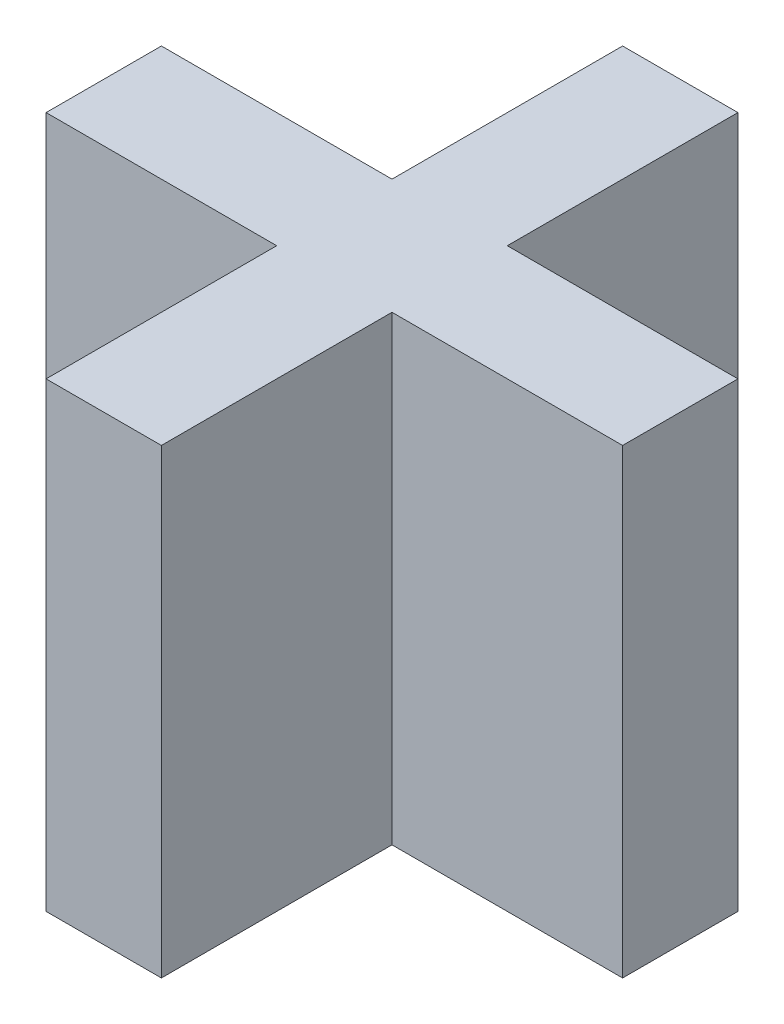
ISO-10303-21;
HEADER;
FILE_DESCRIPTION(('STEP AP214'),'2;1');
FILE_NAME('part.step','',(''),(''),'','','');
FILE_SCHEMA(('AUTOMOTIVE_DESIGN { 1 0 10303 214 1 1 1 1 }'));
ENDSEC;
DATA;
#1=APPLICATION_CONTEXT('core data for automotive mechanical design processes');
#2=APPLICATION_PROTOCOL_DEFINITION('international standard','automotive_design',2000,#1);
#3=PRODUCT_CONTEXT('',#1,'mechanical');
#4=PRODUCT('Part','Part','',(#3));
#5=PRODUCT_RELATED_PRODUCT_CATEGORY('part','',(#4));
#6=PRODUCT_DEFINITION_FORMATION('','',#4);
#7=PRODUCT_DEFINITION_CONTEXT('part definition',#1,'design');
#8=PRODUCT_DEFINITION('design','',#6,#7);
#9=PRODUCT_DEFINITION_SHAPE('','',#8);
#10=(LENGTH_UNIT() NAMED_UNIT(*) SI_UNIT(.MILLI.,.METRE.));
#11=(NAMED_UNIT(*) PLANE_ANGLE_UNIT() SI_UNIT($,.RADIAN.));
#12=(NAMED_UNIT(*) SI_UNIT($,.STERADIAN.) SOLID_ANGLE_UNIT());
#13=UNCERTAINTY_MEASURE_WITH_UNIT(LENGTH_MEASURE(1.E-05),#10,'distance_accuracy_value','');
#14=(GEOMETRIC_REPRESENTATION_CONTEXT(3) GLOBAL_UNCERTAINTY_ASSIGNED_CONTEXT((#13)) GLOBAL_UNIT_ASSIGNED_CONTEXT((#10,
#11,#12)) REPRESENTATION_CONTEXT('',''));
#15=CARTESIAN_POINT('',(0.,0.,0.));
#16=DIRECTION('',(0.,0.,1.));
#17=DIRECTION('',(1.,0.,0.));
#18=AXIS2_PLACEMENT_3D('',#15,#16,#17);
#19=CARTESIAN_POINT('',(-62.5,100.,-12.5));
#20=DIRECTION('',(1.,0.,0.));
#21=DIRECTION('',(0.,0.,-1.));
#22=AXIS2_PLACEMENT_3D('',#19,#20,#21);
#23=PLANE('',#22);
#24=DIRECTION('',(0.,0.,1.));
#25=VECTOR('',#24,1.);
#26=CARTESIAN_POINT('',(-62.5,0.,-12.5));
#27=LINE('',#26,#25);
#28=CARTESIAN_POINT('',(-62.5,0.,-12.5));
#29=VERTEX_POINT('',#28);
#30=CARTESIAN_POINT('',(-62.5,0.,12.5));
#31=VERTEX_POINT('',#30);
#32=EDGE_CURVE('E159',#29,#31,#27,.T.);
#33=ORIENTED_EDGE('',*,*,#32,.T.);
#34=DIRECTION('',(0.,-1.,0.));
#35=VECTOR('',#34,1.);
#36=CARTESIAN_POINT('',(-62.5,100.,12.5));
#37=LINE('',#36,#35);
#38=CARTESIAN_POINT('',(-62.5,100.,12.5));
#39=VERTEX_POINT('',#38);
#40=EDGE_CURVE('E11',#39,#31,#37,.T.);
#41=ORIENTED_EDGE('',*,*,#40,.F.);
#42=DIRECTION('',(0.,0.,1.));
#43=VECTOR('',#42,1.);
#44=CARTESIAN_POINT('',(-62.5,100.,-12.5));
#45=LINE('',#44,#43);
#46=CARTESIAN_POINT('',(-62.5,100.,-12.5));
#47=VERTEX_POINT('',#46);
#48=EDGE_CURVE('E182',#47,#39,#45,.T.);
#49=ORIENTED_EDGE('',*,*,#48,.F.);
#50=DIRECTION('',(0.,-1.,0.));
#51=VECTOR('',#50,1.);
#52=CARTESIAN_POINT('',(-62.5,100.,-12.5));
#53=LINE('',#52,#51);
#54=EDGE_CURVE('E155',#47,#29,#53,.T.);
#55=ORIENTED_EDGE('',*,*,#54,.T.);
#56=EDGE_LOOP('',(#33,#41,#49,#55));
#57=FACE_BOUND('',#56,.T.);
#58=ADVANCED_FACE('F39',(#57),#23,.F.);
#59=CARTESIAN_POINT('',(-62.5,100.,12.5));
#60=DIRECTION('',(0.,0.,-1.));
#61=DIRECTION('',(-1.,0.,0.));
#62=AXIS2_PLACEMENT_3D('',#59,#60,#61);
#63=PLANE('',#62);
#64=DIRECTION('',(1.,0.,0.));
#65=VECTOR('',#64,1.);
#66=CARTESIAN_POINT('',(-62.5,0.,12.5));
#67=LINE('',#66,#65);
#68=CARTESIAN_POINT('',(-12.5,0.,12.5));
#69=VERTEX_POINT('',#68);
#70=EDGE_CURVE('E162',#31,#69,#67,.T.);
#71=ORIENTED_EDGE('',*,*,#70,.T.);
#72=DIRECTION('',(0.,-1.,0.));
#73=VECTOR('',#72,1.);
#74=CARTESIAN_POINT('',(-12.5,100.,12.5));
#75=LINE('',#74,#73);
#76=CARTESIAN_POINT('',(-12.5,100.,12.5));
#77=VERTEX_POINT('',#76);
#78=EDGE_CURVE('E47',#77,#69,#75,.T.);
#79=ORIENTED_EDGE('',*,*,#78,.F.);
#80=DIRECTION('',(1.,0.,0.));
#81=VECTOR('',#80,1.);
#82=CARTESIAN_POINT('',(-62.5,100.,12.5));
#83=LINE('',#82,#81);
#84=EDGE_CURVE('E110',#39,#77,#83,.T.);
#85=ORIENTED_EDGE('',*,*,#84,.F.);
#86=ORIENTED_EDGE('',*,*,#40,.T.);
#87=EDGE_LOOP('',(#71,#79,#85,#86));
#88=FACE_BOUND('',#87,.T.);
#89=ADVANCED_FACE('F260',(#88),#63,.F.);
#90=CARTESIAN_POINT('',(-12.5,100.,12.5));
#91=DIRECTION('',(1.,0.,0.));
#92=DIRECTION('',(0.,0.,-1.));
#93=AXIS2_PLACEMENT_3D('',#90,#91,#92);
#94=PLANE('',#93);
#95=DIRECTION('',(0.,0.,1.));
#96=VECTOR('',#95,1.);
#97=CARTESIAN_POINT('',(-12.5,0.,12.5));
#98=LINE('',#97,#96);
#99=CARTESIAN_POINT('',(-12.5,0.,62.5));
#100=VERTEX_POINT('',#99);
#101=EDGE_CURVE('E165',#69,#100,#98,.T.);
#102=ORIENTED_EDGE('',*,*,#101,.T.);
#103=DIRECTION('',(0.,-1.,0.));
#104=VECTOR('',#103,1.);
#105=CARTESIAN_POINT('',(-12.5,100.,62.5));
#106=LINE('',#105,#104);
#107=CARTESIAN_POINT('',(-12.5,100.,62.5));
#108=VERTEX_POINT('',#107);
#109=EDGE_CURVE('E201',#108,#100,#106,.T.);
#110=ORIENTED_EDGE('',*,*,#109,.F.);
#111=DIRECTION('',(0.,0.,1.));
#112=VECTOR('',#111,1.);
#113=CARTESIAN_POINT('',(-12.5,100.,12.5));
#114=LINE('',#113,#112);
#115=EDGE_CURVE('E209',#77,#108,#114,.T.);
#116=ORIENTED_EDGE('',*,*,#115,.F.);
#117=ORIENTED_EDGE('',*,*,#78,.T.);
#118=EDGE_LOOP('',(#102,#110,#116,#117));
#119=FACE_BOUND('',#118,.T.);
#120=ADVANCED_FACE('F207',(#119),#94,.F.);
#121=CARTESIAN_POINT('',(-12.5,100.,62.5));
#122=DIRECTION('',(0.,0.,-1.));
#123=DIRECTION('',(-1.,0.,0.));
#124=AXIS2_PLACEMENT_3D('',#121,#122,#123);
#125=PLANE('',#124);
#126=DIRECTION('',(1.,0.,0.));
#127=VECTOR('',#126,1.);
#128=CARTESIAN_POINT('',(-12.5,0.,62.5));
#129=LINE('',#128,#127);
#130=CARTESIAN_POINT('',(12.5,0.,62.5));
#131=VERTEX_POINT('',#130);
#132=EDGE_CURVE('E167',#100,#131,#129,.T.);
#133=ORIENTED_EDGE('',*,*,#132,.T.);
#134=DIRECTION('',(0.,-1.,0.));
#135=VECTOR('',#134,1.);
#136=CARTESIAN_POINT('',(12.5,100.,62.5));
#137=LINE('',#136,#135);
#138=CARTESIAN_POINT('',(12.5,100.,62.5));
#139=VERTEX_POINT('',#138);
#140=EDGE_CURVE('E198',#139,#131,#137,.T.);
#141=ORIENTED_EDGE('',*,*,#140,.F.);
#142=DIRECTION('',(1.,0.,0.));
#143=VECTOR('',#142,1.);
#144=CARTESIAN_POINT('',(-12.5,100.,62.5));
#145=LINE('',#144,#143);
#146=EDGE_CURVE('E227',#108,#139,#145,.T.);
#147=ORIENTED_EDGE('',*,*,#146,.F.);
#148=ORIENTED_EDGE('',*,*,#109,.T.);
#149=EDGE_LOOP('',(#133,#141,#147,#148));
#150=FACE_BOUND('',#149,.T.);
#151=ADVANCED_FACE('F218',(#150),#125,.F.);
#152=CARTESIAN_POINT('',(12.5,100.,62.5));
#153=DIRECTION('',(-1.,0.,0.));
#154=DIRECTION('',(0.,0.,1.));
#155=AXIS2_PLACEMENT_3D('',#152,#153,#154);
#156=PLANE('',#155);
#157=DIRECTION('',(0.,0.,-1.));
#158=VECTOR('',#157,1.);
#159=CARTESIAN_POINT('',(12.5,0.,62.5));
#160=LINE('',#159,#158);
#161=CARTESIAN_POINT('',(12.5,0.,12.5));
#162=VERTEX_POINT('',#161);
#163=EDGE_CURVE('E169',#131,#162,#160,.T.);
#164=ORIENTED_EDGE('',*,*,#163,.T.);
#165=DIRECTION('',(0.,-1.,0.));
#166=VECTOR('',#165,1.);
#167=CARTESIAN_POINT('',(12.5,100.,12.5));
#168=LINE('',#167,#166);
#169=CARTESIAN_POINT('',(12.5,100.,12.5));
#170=VERTEX_POINT('',#169);
#171=EDGE_CURVE('E195',#170,#162,#168,.T.);
#172=ORIENTED_EDGE('',*,*,#171,.F.);
#173=DIRECTION('',(0.,0.,-1.));
#174=VECTOR('',#173,1.);
#175=CARTESIAN_POINT('',(12.5,100.,62.5));
#176=LINE('',#175,#174);
#177=EDGE_CURVE('E224',#139,#170,#176,.T.);
#178=ORIENTED_EDGE('',*,*,#177,.F.);
#179=ORIENTED_EDGE('',*,*,#140,.T.);
#180=EDGE_LOOP('',(#164,#172,#178,#179));
#181=FACE_BOUND('',#180,.T.);
#182=ADVANCED_FACE('F222',(#181),#156,.F.);
#183=CARTESIAN_POINT('',(12.5,100.,12.5));
#184=DIRECTION('',(0.,0.,-1.));
#185=DIRECTION('',(-1.,0.,0.));
#186=AXIS2_PLACEMENT_3D('',#183,#184,#185);
#187=PLANE('',#186);
#188=DIRECTION('',(1.,0.,0.));
#189=VECTOR('',#188,1.);
#190=CARTESIAN_POINT('',(12.5,0.,12.5));
#191=LINE('',#190,#189);
#192=CARTESIAN_POINT('',(62.5,0.,12.5));
#193=VERTEX_POINT('',#192);
#194=EDGE_CURVE('E171',#162,#193,#191,.T.);
#195=ORIENTED_EDGE('',*,*,#194,.T.);
#196=DIRECTION('',(0.,-1.,0.));
#197=VECTOR('',#196,1.);
#198=CARTESIAN_POINT('',(62.5,100.,12.5));
#199=LINE('',#198,#197);
#200=CARTESIAN_POINT('',(62.5,100.,12.5));
#201=VERTEX_POINT('',#200);
#202=EDGE_CURVE('E192',#201,#193,#199,.T.);
#203=ORIENTED_EDGE('',*,*,#202,.F.);
#204=DIRECTION('',(1.,0.,0.));
#205=VECTOR('',#204,1.);
#206=CARTESIAN_POINT('',(12.5,100.,12.5));
#207=LINE('',#206,#205);
#208=EDGE_CURVE('E226',#170,#201,#207,.T.);
#209=ORIENTED_EDGE('',*,*,#208,.F.);
#210=ORIENTED_EDGE('',*,*,#171,.T.);
#211=EDGE_LOOP('',(#195,#203,#209,#210));
#212=FACE_BOUND('',#211,.T.);
#213=ADVANCED_FACE('F273',(#212),#187,.F.);
#214=CARTESIAN_POINT('',(62.5,100.,12.5));
#215=DIRECTION('',(-1.,0.,0.));
#216=DIRECTION('',(0.,0.,1.));
#217=AXIS2_PLACEMENT_3D('',#214,#215,#216);
#218=PLANE('',#217);
#219=DIRECTION('',(0.,0.,-1.));
#220=VECTOR('',#219,1.);
#221=CARTESIAN_POINT('',(62.5,0.,12.5));
#222=LINE('',#221,#220);
#223=CARTESIAN_POINT('',(62.5,0.,-12.5));
#224=VERTEX_POINT('',#223);
#225=EDGE_CURVE('E173',#193,#224,#222,.T.);
#226=ORIENTED_EDGE('',*,*,#225,.T.);
#227=DIRECTION('',(0.,-1.,0.));
#228=VECTOR('',#227,1.);
#229=CARTESIAN_POINT('',(62.5,100.,-12.5));
#230=LINE('',#229,#228);
#231=CARTESIAN_POINT('',(62.5,100.,-12.5));
#232=VERTEX_POINT('',#231);
#233=EDGE_CURVE('E189',#232,#224,#230,.T.);
#234=ORIENTED_EDGE('',*,*,#233,.F.);
#235=DIRECTION('',(0.,0.,-1.));
#236=VECTOR('',#235,1.);
#237=CARTESIAN_POINT('',(62.5,100.,12.5));
#238=LINE('',#237,#236);
#239=EDGE_CURVE('E229',#201,#232,#238,.T.);
#240=ORIENTED_EDGE('',*,*,#239,.F.);
#241=ORIENTED_EDGE('',*,*,#202,.T.);
#242=EDGE_LOOP('',(#226,#234,#240,#241));
#243=FACE_BOUND('',#242,.T.);
#244=ADVANCED_FACE('F276',(#243),#218,.F.);
#245=CARTESIAN_POINT('',(62.5,100.,-12.5));
#246=DIRECTION('',(0.,0.,1.));
#247=DIRECTION('',(1.,0.,0.));
#248=AXIS2_PLACEMENT_3D('',#245,#246,#247);
#249=PLANE('',#248);
#250=DIRECTION('',(-1.,0.,0.));
#251=VECTOR('',#250,1.);
#252=CARTESIAN_POINT('',(62.5,0.,-12.5));
#253=LINE('',#252,#251);
#254=CARTESIAN_POINT('',(12.5,0.,-12.5));
#255=VERTEX_POINT('',#254);
#256=EDGE_CURVE('E175',#224,#255,#253,.T.);
#257=ORIENTED_EDGE('',*,*,#256,.T.);
#258=DIRECTION('',(0.,-1.,0.));
#259=VECTOR('',#258,1.);
#260=CARTESIAN_POINT('',(12.5,100.,-12.5));
#261=LINE('',#260,#259);
#262=CARTESIAN_POINT('',(12.5,100.,-12.5));
#263=VERTEX_POINT('',#262);
#264=EDGE_CURVE('E186',#263,#255,#261,.T.);
#265=ORIENTED_EDGE('',*,*,#264,.F.);
#266=DIRECTION('',(-1.,0.,0.));
#267=VECTOR('',#266,1.);
#268=CARTESIAN_POINT('',(62.5,100.,-12.5));
#269=LINE('',#268,#267);
#270=EDGE_CURVE('E235',#232,#263,#269,.T.);
#271=ORIENTED_EDGE('',*,*,#270,.F.);
#272=ORIENTED_EDGE('',*,*,#233,.T.);
#273=EDGE_LOOP('',(#257,#265,#271,#272));
#274=FACE_BOUND('',#273,.T.);
#275=ADVANCED_FACE('F241',(#274),#249,.F.);
#276=CARTESIAN_POINT('',(12.5,100.,-12.5));
#277=DIRECTION('',(-1.,0.,0.));
#278=DIRECTION('',(0.,0.,1.));
#279=AXIS2_PLACEMENT_3D('',#276,#277,#278);
#280=PLANE('',#279);
#281=DIRECTION('',(0.,0.,-1.));
#282=VECTOR('',#281,1.);
#283=CARTESIAN_POINT('',(12.5,0.,-12.5));
#284=LINE('',#283,#282);
#285=CARTESIAN_POINT('',(12.5,0.,-62.5));
#286=VERTEX_POINT('',#285);
#287=EDGE_CURVE('E177',#255,#286,#284,.T.);
#288=ORIENTED_EDGE('',*,*,#287,.T.);
#289=DIRECTION('',(0.,-1.,0.));
#290=VECTOR('',#289,1.);
#291=CARTESIAN_POINT('',(12.5,100.,-62.5));
#292=LINE('',#291,#290);
#293=CARTESIAN_POINT('',(12.5,100.,-62.5));
#294=VERTEX_POINT('',#293);
#295=EDGE_CURVE('E150',#294,#286,#292,.T.);
#296=ORIENTED_EDGE('',*,*,#295,.F.);
#297=DIRECTION('',(0.,0.,-1.));
#298=VECTOR('',#297,1.);
#299=CARTESIAN_POINT('',(12.5,100.,-12.5));
#300=LINE('',#299,#298);
#301=EDGE_CURVE('E141',#263,#294,#300,.T.);
#302=ORIENTED_EDGE('',*,*,#301,.F.);
#303=ORIENTED_EDGE('',*,*,#264,.T.);
#304=EDGE_LOOP('',(#288,#296,#302,#303));
#305=FACE_BOUND('',#304,.T.);
#306=ADVANCED_FACE('F245',(#305),#280,.F.);
#307=CARTESIAN_POINT('',(12.5,100.,-62.5));
#308=DIRECTION('',(0.,0.,1.));
#309=DIRECTION('',(1.,0.,0.));
#310=AXIS2_PLACEMENT_3D('',#307,#308,#309);
#311=PLANE('',#310);
#312=DIRECTION('',(-1.,0.,0.));
#313=VECTOR('',#312,1.);
#314=CARTESIAN_POINT('',(12.5,0.,-62.5));
#315=LINE('',#314,#313);
#316=CARTESIAN_POINT('',(-12.5,0.,-62.5));
#317=VERTEX_POINT('',#316);
#318=EDGE_CURVE('E149',#286,#317,#315,.T.);
#319=ORIENTED_EDGE('',*,*,#318,.T.);
#320=DIRECTION('',(0.,-1.,0.));
#321=VECTOR('',#320,1.);
#322=CARTESIAN_POINT('',(-12.5,100.,-62.5));
#323=LINE('',#322,#321);
#324=CARTESIAN_POINT('',(-12.5,100.,-62.5));
#325=VERTEX_POINT('',#324);
#326=EDGE_CURVE('E146',#325,#317,#323,.T.);
#327=ORIENTED_EDGE('',*,*,#326,.F.);
#328=DIRECTION('',(-1.,0.,0.));
#329=VECTOR('',#328,1.);
#330=CARTESIAN_POINT('',(12.5,100.,-62.5));
#331=LINE('',#330,#329);
#332=EDGE_CURVE('E135',#294,#325,#331,.T.);
#333=ORIENTED_EDGE('',*,*,#332,.F.);
#334=ORIENTED_EDGE('',*,*,#295,.T.);
#335=EDGE_LOOP('',(#319,#327,#333,#334));
#336=FACE_BOUND('',#335,.T.);
#337=ADVANCED_FACE('F147',(#336),#311,.F.);
#338=CARTESIAN_POINT('',(-12.5,100.,-62.5));
#339=DIRECTION('',(1.,0.,0.));
#340=DIRECTION('',(0.,0.,-1.));
#341=AXIS2_PLACEMENT_3D('',#338,#339,#340);
#342=PLANE('',#341);
#343=DIRECTION('',(0.,0.,1.));
#344=VECTOR('',#343,1.);
#345=CARTESIAN_POINT('',(-12.5,0.,-62.5));
#346=LINE('',#345,#344);
#347=CARTESIAN_POINT('',(-12.5,0.,-12.5));
#348=VERTEX_POINT('',#347);
#349=EDGE_CURVE('E96',#317,#348,#346,.T.);
#350=ORIENTED_EDGE('',*,*,#349,.T.);
#351=DIRECTION('',(0.,-1.,0.));
#352=VECTOR('',#351,1.);
#353=CARTESIAN_POINT('',(-12.5,100.,-12.5));
#354=LINE('',#353,#352);
#355=CARTESIAN_POINT('',(-12.5,100.,-12.5));
#356=VERTEX_POINT('',#355);
#357=EDGE_CURVE('E151',#356,#348,#354,.T.);
#358=ORIENTED_EDGE('',*,*,#357,.F.);
#359=DIRECTION('',(0.,0.,1.));
#360=VECTOR('',#359,1.);
#361=CARTESIAN_POINT('',(-12.5,100.,-62.5));
#362=LINE('',#361,#360);
#363=EDGE_CURVE('E139',#325,#356,#362,.T.);
#364=ORIENTED_EDGE('',*,*,#363,.F.);
#365=ORIENTED_EDGE('',*,*,#326,.T.);
#366=EDGE_LOOP('',(#350,#358,#364,#365));
#367=FACE_BOUND('',#366,.T.);
#368=ADVANCED_FACE('F153',(#367),#342,.F.);
#369=CARTESIAN_POINT('',(-12.5,100.,-12.5));
#370=DIRECTION('',(0.,0.,1.));
#371=DIRECTION('',(1.,0.,0.));
#372=AXIS2_PLACEMENT_3D('',#369,#370,#371);
#373=PLANE('',#372);
#374=DIRECTION('',(-1.,0.,0.));
#375=VECTOR('',#374,1.);
#376=CARTESIAN_POINT('',(-12.5,0.,-12.5));
#377=LINE('',#376,#375);
#378=EDGE_CURVE('E102',#348,#29,#377,.T.);
#379=ORIENTED_EDGE('',*,*,#378,.T.);
#380=ORIENTED_EDGE('',*,*,#54,.F.);
#381=DIRECTION('',(-1.,0.,0.));
#382=VECTOR('',#381,1.);
#383=CARTESIAN_POINT('',(-12.5,100.,-12.5));
#384=LINE('',#383,#382);
#385=EDGE_CURVE('E55',#356,#47,#384,.T.);
#386=ORIENTED_EDGE('',*,*,#385,.F.);
#387=ORIENTED_EDGE('',*,*,#357,.T.);
#388=EDGE_LOOP('',(#379,#380,#386,#387));
#389=FACE_BOUND('',#388,.T.);
#390=ADVANCED_FACE('F249',(#389),#373,.F.);
#391=CARTESIAN_POINT('',(0.,100.,0.));
#392=DIRECTION('',(0.,1.,0.));
#393=DIRECTION('',(0.,0.,1.));
#394=AXIS2_PLACEMENT_3D('',#391,#392,#393);
#395=PLANE('',#394);
#396=ORIENTED_EDGE('',*,*,#48,.T.);
#397=ORIENTED_EDGE('',*,*,#84,.T.);
#398=ORIENTED_EDGE('',*,*,#115,.T.);
#399=ORIENTED_EDGE('',*,*,#146,.T.);
#400=ORIENTED_EDGE('',*,*,#177,.T.);
#401=ORIENTED_EDGE('',*,*,#208,.T.);
#402=ORIENTED_EDGE('',*,*,#239,.T.);
#403=ORIENTED_EDGE('',*,*,#270,.T.);
#404=ORIENTED_EDGE('',*,*,#301,.T.);
#405=ORIENTED_EDGE('',*,*,#332,.T.);
#406=ORIENTED_EDGE('',*,*,#363,.T.);
#407=ORIENTED_EDGE('',*,*,#385,.T.);
#408=EDGE_LOOP('',(#396,#397,#398,#399,#400,#401,#402,#403,#404,#405,#406,#407));
#409=FACE_BOUND('',#408,.T.);
#410=ADVANCED_FACE('F137',(#409),#395,.T.);
#411=CARTESIAN_POINT('',(0.,0.,0.));
#412=DIRECTION('',(0.,1.,0.));
#413=DIRECTION('',(0.,0.,1.));
#414=AXIS2_PLACEMENT_3D('',#411,#412,#413);
#415=PLANE('',#414);
#416=CARTESIAN_POINT('',(-50.,0.,0.));
#417=DIRECTION('',(0.,1.,0.));
#418=DIRECTION('',(0.,0.,1.));
#419=AXIS2_PLACEMENT_3D('',#416,#417,#418);
#420=CIRCLE('',#419,4.);
#421=CARTESIAN_POINT('',(-50.,0.,4.));
#422=VERTEX_POINT('',#421);
#423=EDGE_CURVE('E379',#422,#422,#420,.T.);
#424=ORIENTED_EDGE('',*,*,#423,.T.);
#425=EDGE_LOOP('',(#424));
#426=FACE_BOUND('',#425,.T.);
#427=CARTESIAN_POINT('',(0.,0.,0.));
#428=DIRECTION('',(0.,1.,0.));
#429=DIRECTION('',(0.,0.,1.));
#430=AXIS2_PLACEMENT_3D('',#427,#428,#429);
#431=CIRCLE('',#430,4.);
#432=CARTESIAN_POINT('',(0.,0.,4.));
#433=VERTEX_POINT('',#432);
#434=EDGE_CURVE('E382',#433,#433,#431,.T.);
#435=ORIENTED_EDGE('',*,*,#434,.T.);
#436=EDGE_LOOP('',(#435));
#437=FACE_BOUND('',#436,.T.);
#438=CARTESIAN_POINT('',(50.,0.,0.));
#439=DIRECTION('',(0.,1.,0.));
#440=DIRECTION('',(0.,0.,1.));
#441=AXIS2_PLACEMENT_3D('',#438,#439,#440);
#442=CIRCLE('',#441,4.);
#443=CARTESIAN_POINT('',(50.,0.,4.));
#444=VERTEX_POINT('',#443);
#445=EDGE_CURVE('E390',#444,#444,#442,.T.);
#446=ORIENTED_EDGE('',*,*,#445,.T.);
#447=EDGE_LOOP('',(#446));
#448=FACE_BOUND('',#447,.T.);
#449=ORIENTED_EDGE('',*,*,#32,.F.);
#450=ORIENTED_EDGE('',*,*,#378,.F.);
#451=ORIENTED_EDGE('',*,*,#349,.F.);
#452=ORIENTED_EDGE('',*,*,#318,.F.);
#453=ORIENTED_EDGE('',*,*,#287,.F.);
#454=ORIENTED_EDGE('',*,*,#256,.F.);
#455=ORIENTED_EDGE('',*,*,#225,.F.);
#456=ORIENTED_EDGE('',*,*,#194,.F.);
#457=ORIENTED_EDGE('',*,*,#163,.F.);
#458=ORIENTED_EDGE('',*,*,#132,.F.);
#459=ORIENTED_EDGE('',*,*,#101,.F.);
#460=ORIENTED_EDGE('',*,*,#70,.F.);
#461=EDGE_LOOP('',(#449,#450,#451,#452,#453,#454,#455,#456,#457,#458,#459,#460));
#462=FACE_BOUND('',#461,.T.);
#463=ADVANCED_FACE('F213',(#426,#437,#448,#462),#415,.F.);
#464=CARTESIAN_POINT('',(50.,14.,0.));
#465=DIRECTION('',(0.,-1.,0.));
#466=DIRECTION('',(0.,0.,-1.));
#467=AXIS2_PLACEMENT_3D('',#464,#465,#466);
#468=CYLINDRICAL_SURFACE('',#467,4.);
#469=CARTESIAN_POINT('',(50.,14.,0.));
#470=DIRECTION('',(0.,1.,0.));
#471=DIRECTION('',(0.,0.,1.));
#472=AXIS2_PLACEMENT_3D('',#469,#470,#471);
#473=CIRCLE('',#472,4.);
#474=CARTESIAN_POINT('',(50.,14.,4.));
#475=VERTEX_POINT('',#474);
#476=EDGE_CURVE('E393',#475,#475,#473,.T.);
#477=ORIENTED_EDGE('',*,*,#476,.T.);
#478=EDGE_LOOP('',(#477));
#479=FACE_BOUND('',#478,.T.);
#480=ORIENTED_EDGE('',*,*,#445,.F.);
#481=EDGE_LOOP('',(#480));
#482=FACE_BOUND('',#481,.T.);
#483=ADVANCED_FACE('F315',(#479,#482),#468,.F.);
#484=CARTESIAN_POINT('',(50.,14.,0.));
#485=DIRECTION('',(0.,1.,0.));
#486=DIRECTION('',(0.,0.,1.));
#487=AXIS2_PLACEMENT_3D('',#484,#485,#486);
#488=PLANE('',#487);
#489=ORIENTED_EDGE('',*,*,#476,.F.);
#490=EDGE_LOOP('',(#489));
#491=FACE_BOUND('',#490,.T.);
#492=ADVANCED_FACE('F324',(#491),#488,.F.);
#493=CARTESIAN_POINT('',(0.,14.,0.));
#494=DIRECTION('',(0.,-1.,0.));
#495=DIRECTION('',(0.,0.,-1.));
#496=AXIS2_PLACEMENT_3D('',#493,#494,#495);
#497=CYLINDRICAL_SURFACE('',#496,4.);
#498=CARTESIAN_POINT('',(0.,14.,0.));
#499=DIRECTION('',(0.,1.,0.));
#500=DIRECTION('',(0.,0.,1.));
#501=AXIS2_PLACEMENT_3D('',#498,#499,#500);
#502=CIRCLE('',#501,4.);
#503=CARTESIAN_POINT('',(0.,14.,4.));
#504=VERTEX_POINT('',#503);
#505=EDGE_CURVE('E387',#504,#504,#502,.T.);
#506=ORIENTED_EDGE('',*,*,#505,.T.);
#507=EDGE_LOOP('',(#506));
#508=FACE_BOUND('',#507,.T.);
#509=ORIENTED_EDGE('',*,*,#434,.F.);
#510=EDGE_LOOP('',(#509));
#511=FACE_BOUND('',#510,.T.);
#512=ADVANCED_FACE('F334',(#508,#511),#497,.F.);
#513=CARTESIAN_POINT('',(0.,14.,0.));
#514=DIRECTION('',(0.,1.,0.));
#515=DIRECTION('',(0.,0.,1.));
#516=AXIS2_PLACEMENT_3D('',#513,#514,#515);
#517=PLANE('',#516);
#518=ORIENTED_EDGE('',*,*,#505,.F.);
#519=EDGE_LOOP('',(#518));
#520=FACE_BOUND('',#519,.T.);
#521=ADVANCED_FACE('F344',(#520),#517,.F.);
#522=CARTESIAN_POINT('',(-50.,14.,0.));
#523=DIRECTION('',(0.,-1.,0.));
#524=DIRECTION('',(0.,0.,-1.));
#525=AXIS2_PLACEMENT_3D('',#522,#523,#524);
#526=CYLINDRICAL_SURFACE('',#525,4.);
#527=CARTESIAN_POINT('',(-50.,14.,0.));
#528=DIRECTION('',(0.,1.,0.));
#529=DIRECTION('',(0.,0.,1.));
#530=AXIS2_PLACEMENT_3D('',#527,#528,#529);
#531=CIRCLE('',#530,4.);
#532=CARTESIAN_POINT('',(-50.,14.,4.));
#533=VERTEX_POINT('',#532);
#534=EDGE_CURVE('E163',#533,#533,#531,.T.);
#535=ORIENTED_EDGE('',*,*,#534,.T.);
#536=EDGE_LOOP('',(#535));
#537=FACE_BOUND('',#536,.T.);
#538=ORIENTED_EDGE('',*,*,#423,.F.);
#539=EDGE_LOOP('',(#538));
#540=FACE_BOUND('',#539,.T.);
#541=ADVANCED_FACE('F354',(#537,#540),#526,.F.);
#542=CARTESIAN_POINT('',(-50.,14.,0.));
#543=DIRECTION('',(0.,1.,0.));
#544=DIRECTION('',(0.,0.,1.));
#545=AXIS2_PLACEMENT_3D('',#542,#543,#544);
#546=PLANE('',#545);
#547=ORIENTED_EDGE('',*,*,#534,.F.);
#548=EDGE_LOOP('',(#547));
#549=FACE_BOUND('',#548,.T.);
#550=ADVANCED_FACE('F364',(#549),#546,.F.);
#551=CLOSED_SHELL('',(#58,#89,#120,#151,#182,#213,#244,#275,#306,#337,#368,#390,#410,#463,#483,
#492,#512,#521,#541,#550));
#552=MANIFOLD_SOLID_BREP('B2',#551);
#553=ADVANCED_BREP_SHAPE_REPRESENTATION('',(#18,#552),#14);
#554=SHAPE_DEFINITION_REPRESENTATION(#9,#553);
ENDSEC;
END-ISO-10303-21;
